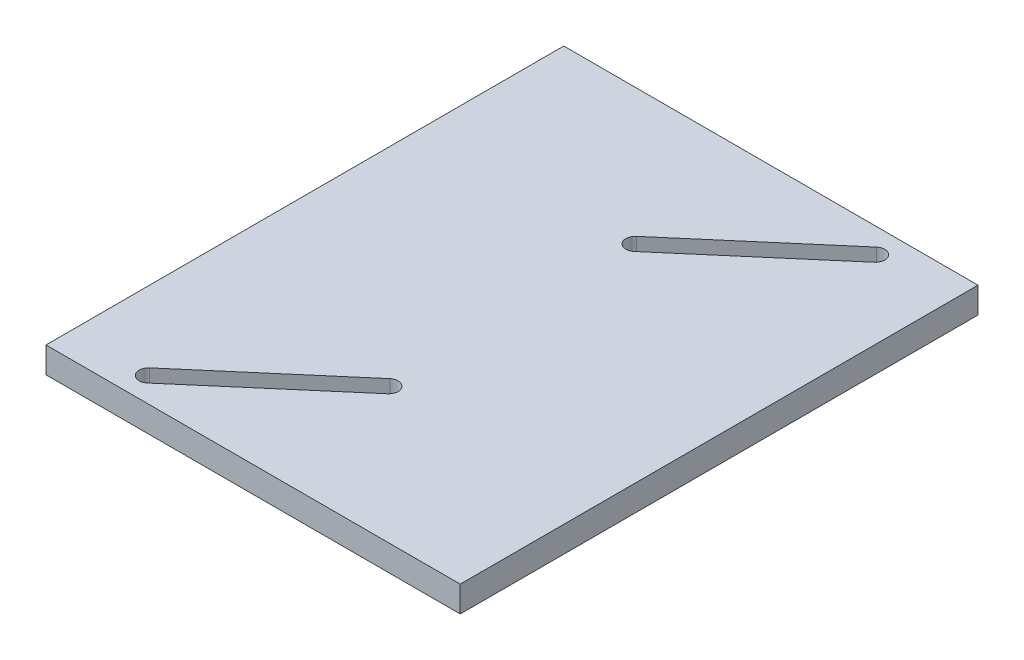
ISO-10303-21;
HEADER;
FILE_DESCRIPTION(('STEP AP214'),'2;1');
FILE_NAME('part.step','',(''),(''),'','','');
FILE_SCHEMA(('AUTOMOTIVE_DESIGN { 1 0 10303 214 1 1 1 1 }'));
ENDSEC;
DATA;
#1=APPLICATION_CONTEXT('core data for automotive mechanical design processes');
#2=APPLICATION_PROTOCOL_DEFINITION('international standard','automotive_design',2000,#1);
#3=PRODUCT_CONTEXT('',#1,'mechanical');
#4=PRODUCT('Part','Part','',(#3));
#5=PRODUCT_RELATED_PRODUCT_CATEGORY('part','',(#4));
#6=PRODUCT_DEFINITION_FORMATION('','',#4);
#7=PRODUCT_DEFINITION_CONTEXT('part definition',#1,'design');
#8=PRODUCT_DEFINITION('design','',#6,#7);
#9=PRODUCT_DEFINITION_SHAPE('','',#8);
#10=(LENGTH_UNIT() NAMED_UNIT(*) SI_UNIT(.MILLI.,.METRE.));
#11=(NAMED_UNIT(*) PLANE_ANGLE_UNIT() SI_UNIT($,.RADIAN.));
#12=(NAMED_UNIT(*) SI_UNIT($,.STERADIAN.) SOLID_ANGLE_UNIT());
#13=UNCERTAINTY_MEASURE_WITH_UNIT(LENGTH_MEASURE(1.E-05),#10,'distance_accuracy_value','');
#14=(GEOMETRIC_REPRESENTATION_CONTEXT(3) GLOBAL_UNCERTAINTY_ASSIGNED_CONTEXT((#13)) GLOBAL_UNIT_ASSIGNED_CONTEXT((#10,
#11,#12)) REPRESENTATION_CONTEXT('',''));
#15=CARTESIAN_POINT('',(0.,0.,0.));
#16=DIRECTION('',(0.,0.,1.));
#17=DIRECTION('',(1.,0.,0.));
#18=AXIS2_PLACEMENT_3D('',#15,#16,#17);
#19=CARTESIAN_POINT('',(-50.8,6.35,63.5));
#20=DIRECTION('',(1.,0.,0.));
#21=DIRECTION('',(0.,0.,-1.));
#22=AXIS2_PLACEMENT_3D('',#19,#20,#21);
#23=PLANE('',#22);
#24=DIRECTION('',(0.,0.,1.));
#25=VECTOR('',#24,1.);
#26=CARTESIAN_POINT('',(-50.8,0.,63.5));
#27=LINE('',#26,#25);
#28=CARTESIAN_POINT('',(-50.8,0.,-63.5));
#29=VERTEX_POINT('',#28);
#30=CARTESIAN_POINT('',(-50.8,0.,63.5));
#31=VERTEX_POINT('',#30);
#32=EDGE_CURVE('E157',#29,#31,#27,.T.);
#33=ORIENTED_EDGE('',*,*,#32,.T.);
#34=DIRECTION('',(0.,-1.,0.));
#35=VECTOR('',#34,1.);
#36=CARTESIAN_POINT('',(-50.8,6.35,63.5));
#37=LINE('',#36,#35);
#38=CARTESIAN_POINT('',(-50.8,6.35,63.5));
#39=VERTEX_POINT('',#38);
#40=EDGE_CURVE('E11',#39,#31,#37,.T.);
#41=ORIENTED_EDGE('',*,*,#40,.F.);
#42=DIRECTION('',(0.,0.,1.));
#43=VECTOR('',#42,1.);
#44=CARTESIAN_POINT('',(-50.8,6.35,63.5));
#45=LINE('',#44,#43);
#46=CARTESIAN_POINT('',(-50.8,6.35,-63.5));
#47=VERTEX_POINT('',#46);
#48=EDGE_CURVE('E190',#47,#39,#45,.T.);
#49=ORIENTED_EDGE('',*,*,#48,.F.);
#50=DIRECTION('',(0.,-1.,0.));
#51=VECTOR('',#50,1.);
#52=CARTESIAN_POINT('',(-50.8,6.35,-63.5));
#53=LINE('',#52,#51);
#54=EDGE_CURVE('E200',#47,#29,#53,.T.);
#55=ORIENTED_EDGE('',*,*,#54,.T.);
#56=EDGE_LOOP('',(#33,#41,#49,#55));
#57=FACE_BOUND('',#56,.T.);
#58=ADVANCED_FACE('F32',(#57),#23,.F.);
#59=CARTESIAN_POINT('',(-50.8,6.35,63.5));
#60=DIRECTION('',(0.,0.,-1.));
#61=DIRECTION('',(-1.,0.,0.));
#62=AXIS2_PLACEMENT_3D('',#59,#60,#61);
#63=PLANE('',#62);
#64=DIRECTION('',(1.,0.,0.));
#65=VECTOR('',#64,1.);
#66=CARTESIAN_POINT('',(-50.8,0.,63.5));
#67=LINE('',#66,#65);
#68=CARTESIAN_POINT('',(50.8,0.,63.5));
#69=VERTEX_POINT('',#68);
#70=EDGE_CURVE('E203',#31,#69,#67,.T.);
#71=ORIENTED_EDGE('',*,*,#70,.T.);
#72=DIRECTION('',(0.,-1.,0.));
#73=VECTOR('',#72,1.);
#74=CARTESIAN_POINT('',(50.8,6.35,63.5));
#75=LINE('',#74,#73);
#76=CARTESIAN_POINT('',(50.8,6.35,63.5));
#77=VERTEX_POINT('',#76);
#78=EDGE_CURVE('E39',#77,#69,#75,.T.);
#79=ORIENTED_EDGE('',*,*,#78,.F.);
#80=DIRECTION('',(1.,0.,0.));
#81=VECTOR('',#80,1.);
#82=CARTESIAN_POINT('',(-50.8,6.35,63.5));
#83=LINE('',#82,#81);
#84=EDGE_CURVE('E193',#39,#77,#83,.T.);
#85=ORIENTED_EDGE('',*,*,#84,.F.);
#86=ORIENTED_EDGE('',*,*,#40,.T.);
#87=EDGE_LOOP('',(#71,#79,#85,#86));
#88=FACE_BOUND('',#87,.T.);
#89=ADVANCED_FACE('F232',(#88),#63,.F.);
#90=CARTESIAN_POINT('',(50.8,6.35,63.5));
#91=DIRECTION('',(-1.,0.,0.));
#92=DIRECTION('',(0.,0.,1.));
#93=AXIS2_PLACEMENT_3D('',#90,#91,#92);
#94=PLANE('',#93);
#95=DIRECTION('',(0.,0.,-1.));
#96=VECTOR('',#95,1.);
#97=CARTESIAN_POINT('',(50.8,0.,63.5));
#98=LINE('',#97,#96);
#99=CARTESIAN_POINT('',(50.8,0.,-63.5));
#100=VERTEX_POINT('',#99);
#101=EDGE_CURVE('E205',#69,#100,#98,.T.);
#102=ORIENTED_EDGE('',*,*,#101,.T.);
#103=DIRECTION('',(0.,-1.,0.));
#104=VECTOR('',#103,1.);
#105=CARTESIAN_POINT('',(50.8,6.35,-63.5));
#106=LINE('',#105,#104);
#107=CARTESIAN_POINT('',(50.8,6.35,-63.5));
#108=VERTEX_POINT('',#107);
#109=EDGE_CURVE('E210',#108,#100,#106,.T.);
#110=ORIENTED_EDGE('',*,*,#109,.F.);
#111=DIRECTION('',(0.,0.,-1.));
#112=VECTOR('',#111,1.);
#113=CARTESIAN_POINT('',(50.8,6.35,63.5));
#114=LINE('',#113,#112);
#115=EDGE_CURVE('E196',#77,#108,#114,.T.);
#116=ORIENTED_EDGE('',*,*,#115,.F.);
#117=ORIENTED_EDGE('',*,*,#78,.T.);
#118=EDGE_LOOP('',(#102,#110,#116,#117));
#119=FACE_BOUND('',#118,.T.);
#120=ADVANCED_FACE('F217',(#119),#94,.F.);
#121=CARTESIAN_POINT('',(-50.8,6.35,-63.5));
#122=DIRECTION('',(0.,0.,1.));
#123=DIRECTION('',(1.,0.,0.));
#124=AXIS2_PLACEMENT_3D('',#121,#122,#123);
#125=PLANE('',#124);
#126=DIRECTION('',(-1.,0.,0.));
#127=VECTOR('',#126,1.);
#128=CARTESIAN_POINT('',(-50.8,0.,-63.5));
#129=LINE('',#128,#127);
#130=EDGE_CURVE('E194',#100,#29,#129,.T.);
#131=ORIENTED_EDGE('',*,*,#130,.T.);
#132=ORIENTED_EDGE('',*,*,#54,.F.);
#133=DIRECTION('',(-1.,0.,0.));
#134=VECTOR('',#133,1.);
#135=CARTESIAN_POINT('',(-50.8,6.35,-63.5));
#136=LINE('',#135,#134);
#137=EDGE_CURVE('E198',#108,#47,#136,.T.);
#138=ORIENTED_EDGE('',*,*,#137,.F.);
#139=ORIENTED_EDGE('',*,*,#109,.T.);
#140=EDGE_LOOP('',(#131,#132,#138,#139));
#141=FACE_BOUND('',#140,.T.);
#142=ADVANCED_FACE('F225',(#141),#125,.F.);
#143=CARTESIAN_POINT('',(0.,6.35,0.));
#144=DIRECTION('',(0.,-1.,0.));
#145=DIRECTION('',(0.,0.,-1.));
#146=AXIS2_PLACEMENT_3D('',#143,#144,#145);
#147=PLANE('',#146);
#148=DIRECTION('',(0.759685436236599,0.,-0.650290733418529));
#149=VECTOR('',#148,1.);
#150=CARTESIAN_POINT('',(1.48656461659475,6.35,-28.4893590927631));
#151=LINE('',#150,#149);
#152=CARTESIAN_POINT('',(1.48656461659475,6.35,-28.4893590927631));
#153=VERTEX_POINT('',#152);
#154=CARTESIAN_POINT('',(33.2365646165948,6.35,-55.6673590927631));
#155=VERTEX_POINT('',#154);
#156=EDGE_CURVE('E150',#153,#155,#151,.T.);
#157=ORIENTED_EDGE('',*,*,#156,.F.);
#158=CARTESIAN_POINT('',(0.,6.35,-30.226));
#159=DIRECTION('',(0.,1.,0.));
#160=DIRECTION('',(0.,0.,1.));
#161=AXIS2_PLACEMENT_3D('',#158,#159,#160);
#162=CIRCLE('',#161,2.28599999999999);
#163=CARTESIAN_POINT('',(-1.48656461659475,6.35,-31.9626409072369));
#164=VERTEX_POINT('',#163);
#165=EDGE_CURVE('E46',#164,#153,#162,.T.);
#166=ORIENTED_EDGE('',*,*,#165,.F.);
#167=DIRECTION('',(-0.759685436236599,0.,0.650290733418529));
#168=VECTOR('',#167,1.);
#169=CARTESIAN_POINT('',(-1.48656461659475,6.35,-31.9626409072369));
#170=LINE('',#169,#168);
#171=CARTESIAN_POINT('',(30.2634353834052,6.35,-59.1406409072369));
#172=VERTEX_POINT('',#171);
#173=EDGE_CURVE('E141',#172,#164,#170,.T.);
#174=ORIENTED_EDGE('',*,*,#173,.F.);
#175=CARTESIAN_POINT('',(31.75,6.35,-57.404));
#176=DIRECTION('',(0.,1.,0.));
#177=DIRECTION('',(0.,0.,1.));
#178=AXIS2_PLACEMENT_3D('',#175,#176,#177);
#179=CIRCLE('',#178,2.28600000000001);
#180=EDGE_CURVE('E144',#155,#172,#179,.T.);
#181=ORIENTED_EDGE('',*,*,#180,.F.);
#182=EDGE_LOOP('',(#157,#166,#174,#181));
#183=FACE_BOUND('',#182,.T.);
#184=DIRECTION('',(-0.75968543623666,0.,0.650290733418458));
#185=VECTOR('',#184,1.);
#186=CARTESIAN_POINT('',(-1.48656461659495,6.35,28.4893590927631));
#187=LINE('',#186,#185);
#188=CARTESIAN_POINT('',(-1.48656461659495,6.35,28.4893590927631));
#189=VERTEX_POINT('',#188);
#190=CARTESIAN_POINT('',(-33.2365646165973,6.35,55.6673590927601));
#191=VERTEX_POINT('',#190);
#192=EDGE_CURVE('E176',#189,#191,#187,.T.);
#193=ORIENTED_EDGE('',*,*,#192,.F.);
#194=CARTESIAN_POINT('',(-2.11067029895745E-13,6.35,30.226));
#195=DIRECTION('',(0.,1.,0.));
#196=DIRECTION('',(0.,0.,1.));
#197=AXIS2_PLACEMENT_3D('',#194,#195,#196);
#198=CIRCLE('',#197,2.28599999999999);
#199=CARTESIAN_POINT('',(1.48656461659453,6.35,31.9626409072369));
#200=VERTEX_POINT('',#199);
#201=EDGE_CURVE('E54',#200,#189,#198,.T.);
#202=ORIENTED_EDGE('',*,*,#201,.F.);
#203=DIRECTION('',(0.759685436236659,0.,-0.650290733418459));
#204=VECTOR('',#203,1.);
#205=CARTESIAN_POINT('',(1.48656461659453,6.35,31.9626409072369));
#206=LINE('',#205,#204);
#207=CARTESIAN_POINT('',(-30.2634353834081,6.35,59.1406409072341));
#208=VERTEX_POINT('',#207);
#209=EDGE_CURVE('E165',#208,#200,#206,.T.);
#210=ORIENTED_EDGE('',*,*,#209,.F.);
#211=CARTESIAN_POINT('',(-31.7500000000027,6.35,57.4039999999971));
#212=DIRECTION('',(0.,1.,0.));
#213=DIRECTION('',(0.,0.,1.));
#214=AXIS2_PLACEMENT_3D('',#211,#212,#213);
#215=CIRCLE('',#214,2.28600000000001);
#216=EDGE_CURVE('E179',#191,#208,#215,.T.);
#217=ORIENTED_EDGE('',*,*,#216,.F.);
#218=EDGE_LOOP('',(#193,#202,#210,#217));
#219=FACE_BOUND('',#218,.T.);
#220=ORIENTED_EDGE('',*,*,#48,.T.);
#221=ORIENTED_EDGE('',*,*,#84,.T.);
#222=ORIENTED_EDGE('',*,*,#115,.T.);
#223=ORIENTED_EDGE('',*,*,#137,.T.);
#224=EDGE_LOOP('',(#220,#221,#222,#223));
#225=FACE_BOUND('',#224,.T.);
#226=ADVANCED_FACE('F231',(#183,#219,#225),#147,.F.);
#227=CARTESIAN_POINT('',(0.,0.,0.));
#228=DIRECTION('',(0.,-1.,0.));
#229=DIRECTION('',(0.,0.,-1.));
#230=AXIS2_PLACEMENT_3D('',#227,#228,#229);
#231=PLANE('',#230);
#232=CARTESIAN_POINT('',(0.,0.,-30.226));
#233=DIRECTION('',(0.,1.,0.));
#234=DIRECTION('',(0.,0.,1.));
#235=AXIS2_PLACEMENT_3D('',#232,#233,#234);
#236=CIRCLE('',#235,2.28599999999999);
#237=CARTESIAN_POINT('',(-1.48656461659475,0.,-31.9626409072369));
#238=VERTEX_POINT('',#237);
#239=CARTESIAN_POINT('',(1.48656461659475,0.,-28.4893590927631));
#240=VERTEX_POINT('',#239);
#241=EDGE_CURVE('E122',#238,#240,#236,.T.);
#242=ORIENTED_EDGE('',*,*,#241,.T.);
#243=DIRECTION('',(0.759685436236599,0.,-0.650290733418529));
#244=VECTOR('',#243,1.);
#245=CARTESIAN_POINT('',(1.48656461659475,0.,-28.4893590927631));
#246=LINE('',#245,#244);
#247=CARTESIAN_POINT('',(33.2365646165948,0.,-55.6673590927631));
#248=VERTEX_POINT('',#247);
#249=EDGE_CURVE('E132',#240,#248,#246,.T.);
#250=ORIENTED_EDGE('',*,*,#249,.T.);
#251=CARTESIAN_POINT('',(31.75,0.,-57.404));
#252=DIRECTION('',(0.,1.,0.));
#253=DIRECTION('',(0.,0.,1.));
#254=AXIS2_PLACEMENT_3D('',#251,#252,#253);
#255=CIRCLE('',#254,2.28600000000001);
#256=CARTESIAN_POINT('',(30.2634353834052,0.,-59.1406409072369));
#257=VERTEX_POINT('',#256);
#258=EDGE_CURVE('E136',#248,#257,#255,.T.);
#259=ORIENTED_EDGE('',*,*,#258,.T.);
#260=DIRECTION('',(-0.759685436236599,0.,0.650290733418529));
#261=VECTOR('',#260,1.);
#262=CARTESIAN_POINT('',(-1.48656461659475,0.,-31.9626409072369));
#263=LINE('',#262,#261);
#264=EDGE_CURVE('E128',#257,#238,#263,.T.);
#265=ORIENTED_EDGE('',*,*,#264,.T.);
#266=EDGE_LOOP('',(#242,#250,#259,#265));
#267=FACE_BOUND('',#266,.T.);
#268=CARTESIAN_POINT('',(-2.11067029895745E-13,0.,30.226));
#269=DIRECTION('',(0.,1.,0.));
#270=DIRECTION('',(0.,0.,1.));
#271=AXIS2_PLACEMENT_3D('',#268,#269,#270);
#272=CIRCLE('',#271,2.28599999999999);
#273=CARTESIAN_POINT('',(1.48656461659453,0.,31.9626409072369));
#274=VERTEX_POINT('',#273);
#275=CARTESIAN_POINT('',(-1.48656461659495,0.,28.4893590927631));
#276=VERTEX_POINT('',#275);
#277=EDGE_CURVE('E161',#274,#276,#272,.T.);
#278=ORIENTED_EDGE('',*,*,#277,.T.);
#279=DIRECTION('',(-0.75968543623666,0.,0.650290733418458));
#280=VECTOR('',#279,1.);
#281=CARTESIAN_POINT('',(-1.48656461659495,0.,28.4893590927631));
#282=LINE('',#281,#280);
#283=CARTESIAN_POINT('',(-33.2365646165973,0.,55.6673590927601));
#284=VERTEX_POINT('',#283);
#285=EDGE_CURVE('E164',#276,#284,#282,.T.);
#286=ORIENTED_EDGE('',*,*,#285,.T.);
#287=CARTESIAN_POINT('',(-31.7500000000027,0.,57.4039999999971));
#288=DIRECTION('',(0.,1.,0.));
#289=DIRECTION('',(0.,0.,1.));
#290=AXIS2_PLACEMENT_3D('',#287,#288,#289);
#291=CIRCLE('',#290,2.28600000000001);
#292=CARTESIAN_POINT('',(-30.2634353834081,0.,59.1406409072341));
#293=VERTEX_POINT('',#292);
#294=EDGE_CURVE('E168',#284,#293,#291,.T.);
#295=ORIENTED_EDGE('',*,*,#294,.T.);
#296=DIRECTION('',(0.759685436236659,0.,-0.650290733418459));
#297=VECTOR('',#296,1.);
#298=CARTESIAN_POINT('',(1.48656461659453,0.,31.9626409072369));
#299=LINE('',#298,#297);
#300=EDGE_CURVE('E171',#293,#274,#299,.T.);
#301=ORIENTED_EDGE('',*,*,#300,.T.);
#302=EDGE_LOOP('',(#278,#286,#295,#301));
#303=FACE_BOUND('',#302,.T.);
#304=ORIENTED_EDGE('',*,*,#32,.F.);
#305=ORIENTED_EDGE('',*,*,#130,.F.);
#306=ORIENTED_EDGE('',*,*,#101,.F.);
#307=ORIENTED_EDGE('',*,*,#70,.F.);
#308=EDGE_LOOP('',(#304,#305,#306,#307));
#309=FACE_BOUND('',#308,.T.);
#310=ADVANCED_FACE('F138',(#267,#303,#309),#231,.T.);
#311=CARTESIAN_POINT('',(-2.11067029895745E-13,0.,30.226));
#312=DIRECTION('',(0.,1.,0.));
#313=DIRECTION('',(0.,0.,1.));
#314=AXIS2_PLACEMENT_3D('',#311,#312,#313);
#315=CYLINDRICAL_SURFACE('',#314,2.28599999999999);
#316=ORIENTED_EDGE('',*,*,#201,.T.);
#317=DIRECTION('',(0.,1.,0.));
#318=VECTOR('',#317,1.);
#319=CARTESIAN_POINT('',(-1.48656461659495,0.,28.4893590927631));
#320=LINE('',#319,#318);
#321=EDGE_CURVE('E174',#276,#189,#320,.T.);
#322=ORIENTED_EDGE('',*,*,#321,.F.);
#323=ORIENTED_EDGE('',*,*,#277,.F.);
#324=DIRECTION('',(0.,1.,0.));
#325=VECTOR('',#324,1.);
#326=CARTESIAN_POINT('',(1.48656461659453,0.,31.9626409072369));
#327=LINE('',#326,#325);
#328=EDGE_CURVE('E151',#274,#200,#327,.T.);
#329=ORIENTED_EDGE('',*,*,#328,.T.);
#330=EDGE_LOOP('',(#316,#322,#323,#329));
#331=FACE_BOUND('',#330,.T.);
#332=ADVANCED_FACE('F244',(#331),#315,.F.);
#333=CARTESIAN_POINT('',(1.48656461659453,0.,31.9626409072369));
#334=DIRECTION('',(0.650290733418459,0.,0.759685436236659));
#335=DIRECTION('',(0.759685436236659,0.,-0.650290733418459));
#336=AXIS2_PLACEMENT_3D('',#333,#334,#335);
#337=PLANE('',#336);
#338=ORIENTED_EDGE('',*,*,#209,.T.);
#339=ORIENTED_EDGE('',*,*,#328,.F.);
#340=ORIENTED_EDGE('',*,*,#300,.F.);
#341=DIRECTION('',(0.,1.,0.));
#342=VECTOR('',#341,1.);
#343=CARTESIAN_POINT('',(-30.2634353834081,0.,59.1406409072341));
#344=LINE('',#343,#342);
#345=EDGE_CURVE('E185',#293,#208,#344,.T.);
#346=ORIENTED_EDGE('',*,*,#345,.T.);
#347=EDGE_LOOP('',(#338,#339,#340,#346));
#348=FACE_BOUND('',#347,.T.);
#349=ADVANCED_FACE('F250',(#348),#337,.F.);
#350=CARTESIAN_POINT('',(-31.7500000000027,0.,57.4039999999971));
#351=DIRECTION('',(0.,1.,0.));
#352=DIRECTION('',(0.,0.,1.));
#353=AXIS2_PLACEMENT_3D('',#350,#351,#352);
#354=CYLINDRICAL_SURFACE('',#353,2.28600000000001);
#355=ORIENTED_EDGE('',*,*,#216,.T.);
#356=ORIENTED_EDGE('',*,*,#345,.F.);
#357=ORIENTED_EDGE('',*,*,#294,.F.);
#358=DIRECTION('',(0.,1.,0.));
#359=VECTOR('',#358,1.);
#360=CARTESIAN_POINT('',(-33.2365646165973,0.,55.6673590927601));
#361=LINE('',#360,#359);
#362=EDGE_CURVE('E187',#284,#191,#361,.T.);
#363=ORIENTED_EDGE('',*,*,#362,.T.);
#364=EDGE_LOOP('',(#355,#356,#357,#363));
#365=FACE_BOUND('',#364,.T.);
#366=ADVANCED_FACE('F254',(#365),#354,.F.);
#367=CARTESIAN_POINT('',(-1.48656461659495,0.,28.4893590927631));
#368=DIRECTION('',(-0.650290733418458,0.,-0.75968543623666));
#369=DIRECTION('',(-0.75968543623666,0.,0.650290733418458));
#370=AXIS2_PLACEMENT_3D('',#367,#368,#369);
#371=PLANE('',#370);
#372=ORIENTED_EDGE('',*,*,#192,.T.);
#373=ORIENTED_EDGE('',*,*,#362,.F.);
#374=ORIENTED_EDGE('',*,*,#285,.F.);
#375=ORIENTED_EDGE('',*,*,#321,.T.);
#376=EDGE_LOOP('',(#372,#373,#374,#375));
#377=FACE_BOUND('',#376,.T.);
#378=ADVANCED_FACE('F251',(#377),#371,.F.);
#379=CARTESIAN_POINT('',(0.,0.,-30.226));
#380=DIRECTION('',(0.,1.,0.));
#381=DIRECTION('',(0.,0.,1.));
#382=AXIS2_PLACEMENT_3D('',#379,#380,#381);
#383=CYLINDRICAL_SURFACE('',#382,2.28599999999999);
#384=ORIENTED_EDGE('',*,*,#165,.T.);
#385=DIRECTION('',(0.,1.,0.));
#386=VECTOR('',#385,1.);
#387=CARTESIAN_POINT('',(1.48656461659475,0.,-28.4893590927631));
#388=LINE('',#387,#386);
#389=EDGE_CURVE('E118',#240,#153,#388,.T.);
#390=ORIENTED_EDGE('',*,*,#389,.F.);
#391=ORIENTED_EDGE('',*,*,#241,.F.);
#392=DIRECTION('',(0.,1.,0.));
#393=VECTOR('',#392,1.);
#394=CARTESIAN_POINT('',(-1.48656461659475,0.,-31.9626409072369));
#395=LINE('',#394,#393);
#396=EDGE_CURVE('E155',#238,#164,#395,.T.);
#397=ORIENTED_EDGE('',*,*,#396,.T.);
#398=EDGE_LOOP('',(#384,#390,#391,#397));
#399=FACE_BOUND('',#398,.T.);
#400=ADVANCED_FACE('F120',(#399),#383,.F.);
#401=CARTESIAN_POINT('',(-1.48656461659475,0.,-31.9626409072369));
#402=DIRECTION('',(-0.650290733418529,0.,-0.759685436236599));
#403=DIRECTION('',(-0.759685436236599,0.,0.650290733418529));
#404=AXIS2_PLACEMENT_3D('',#401,#402,#403);
#405=PLANE('',#404);
#406=ORIENTED_EDGE('',*,*,#173,.T.);
#407=ORIENTED_EDGE('',*,*,#396,.F.);
#408=ORIENTED_EDGE('',*,*,#264,.F.);
#409=DIRECTION('',(0.,1.,0.));
#410=VECTOR('',#409,1.);
#411=CARTESIAN_POINT('',(30.2634353834052,0.,-59.1406409072369));
#412=LINE('',#411,#410);
#413=EDGE_CURVE('E158',#257,#172,#412,.T.);
#414=ORIENTED_EDGE('',*,*,#413,.T.);
#415=EDGE_LOOP('',(#406,#407,#408,#414));
#416=FACE_BOUND('',#415,.T.);
#417=ADVANCED_FACE('F264',(#416),#405,.F.);
#418=CARTESIAN_POINT('',(31.75,0.,-57.404));
#419=DIRECTION('',(0.,1.,0.));
#420=DIRECTION('',(0.,0.,1.));
#421=AXIS2_PLACEMENT_3D('',#418,#419,#420);
#422=CYLINDRICAL_SURFACE('',#421,2.28600000000001);
#423=ORIENTED_EDGE('',*,*,#180,.T.);
#424=ORIENTED_EDGE('',*,*,#413,.F.);
#425=ORIENTED_EDGE('',*,*,#258,.F.);
#426=DIRECTION('',(0.,1.,0.));
#427=VECTOR('',#426,1.);
#428=CARTESIAN_POINT('',(33.2365646165948,0.,-55.6673590927631));
#429=LINE('',#428,#427);
#430=EDGE_CURVE('E127',#248,#155,#429,.T.);
#431=ORIENTED_EDGE('',*,*,#430,.T.);
#432=EDGE_LOOP('',(#423,#424,#425,#431));
#433=FACE_BOUND('',#432,.T.);
#434=ADVANCED_FACE('F267',(#433),#422,.F.);
#435=CARTESIAN_POINT('',(1.48656461659475,0.,-28.4893590927631));
#436=DIRECTION('',(0.650290733418529,0.,0.759685436236599));
#437=DIRECTION('',(0.759685436236599,0.,-0.650290733418529));
#438=AXIS2_PLACEMENT_3D('',#435,#436,#437);
#439=PLANE('',#438);
#440=ORIENTED_EDGE('',*,*,#156,.T.);
#441=ORIENTED_EDGE('',*,*,#430,.F.);
#442=ORIENTED_EDGE('',*,*,#249,.F.);
#443=ORIENTED_EDGE('',*,*,#389,.T.);
#444=EDGE_LOOP('',(#440,#441,#442,#443));
#445=FACE_BOUND('',#444,.T.);
#446=ADVANCED_FACE('F133',(#445),#439,.F.);
#447=CLOSED_SHELL('',(#58,#89,#120,#142,#226,#310,#332,#349,#366,#378,#400,#417,#434,#446));
#448=MANIFOLD_SOLID_BREP('B2',#447);
#449=ADVANCED_BREP_SHAPE_REPRESENTATION('',(#18,#448),#14);
#450=SHAPE_DEFINITION_REPRESENTATION(#9,#449);
ENDSEC;
END-ISO-10303-21;
